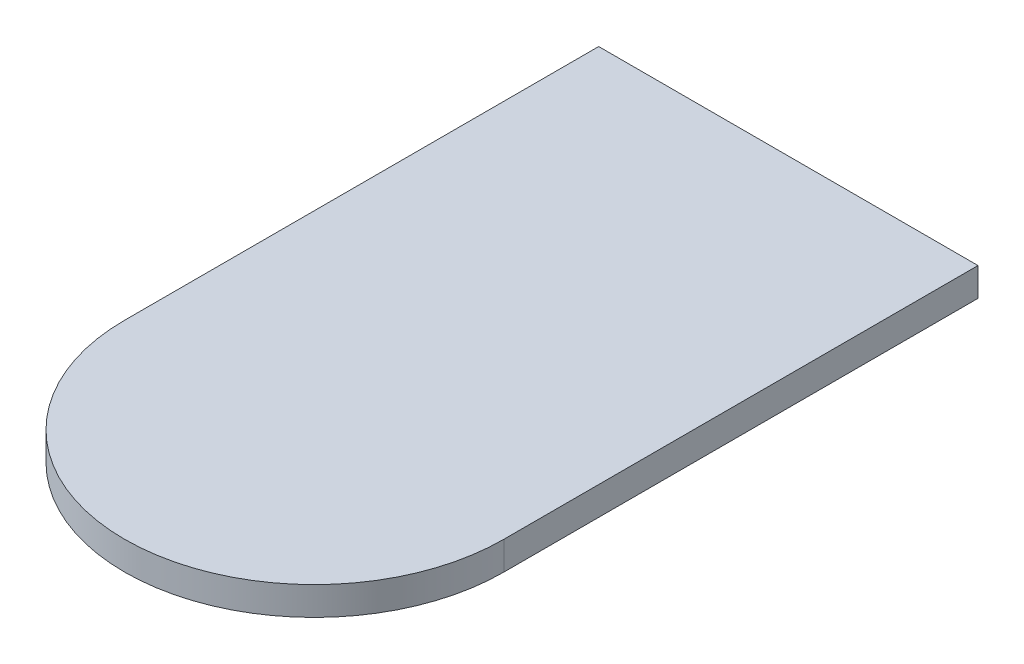
ISO-10303-21;
HEADER;
FILE_DESCRIPTION(('STEP AP214'),'2;1');
FILE_NAME('part.step','',(''),(''),'','','');
FILE_SCHEMA(('AUTOMOTIVE_DESIGN { 1 0 10303 214 1 1 1 1 }'));
ENDSEC;
DATA;
#1=APPLICATION_CONTEXT('core data for automotive mechanical design processes');
#2=APPLICATION_PROTOCOL_DEFINITION('international standard','automotive_design',2000,#1);
#3=PRODUCT_CONTEXT('',#1,'mechanical');
#4=PRODUCT('Part','Part','',(#3));
#5=PRODUCT_RELATED_PRODUCT_CATEGORY('part','',(#4));
#6=PRODUCT_DEFINITION_FORMATION('','',#4);
#7=PRODUCT_DEFINITION_CONTEXT('part definition',#1,'design');
#8=PRODUCT_DEFINITION('design','',#6,#7);
#9=PRODUCT_DEFINITION_SHAPE('','',#8);
#10=(LENGTH_UNIT() NAMED_UNIT(*) SI_UNIT(.MILLI.,.METRE.));
#11=(NAMED_UNIT(*) PLANE_ANGLE_UNIT() SI_UNIT($,.RADIAN.));
#12=(NAMED_UNIT(*) SI_UNIT($,.STERADIAN.) SOLID_ANGLE_UNIT());
#13=UNCERTAINTY_MEASURE_WITH_UNIT(LENGTH_MEASURE(1.E-05),#10,'distance_accuracy_value','');
#14=(GEOMETRIC_REPRESENTATION_CONTEXT(3) GLOBAL_UNCERTAINTY_ASSIGNED_CONTEXT((#13)) GLOBAL_UNIT_ASSIGNED_CONTEXT((#10,
#11,#12)) REPRESENTATION_CONTEXT('',''));
#15=CARTESIAN_POINT('',(0.,0.,0.));
#16=DIRECTION('',(0.,0.,1.));
#17=DIRECTION('',(1.,0.,0.));
#18=AXIS2_PLACEMENT_3D('',#15,#16,#17);
#19=CARTESIAN_POINT('',(0.,1.2,0.));
#20=DIRECTION('',(0.,-1.,0.));
#21=DIRECTION('',(0.,0.,-1.));
#22=AXIS2_PLACEMENT_3D('',#19,#20,#21);
#23=CYLINDRICAL_SURFACE('',#22,8.);
#24=CARTESIAN_POINT('',(0.,0.,0.));
#25=DIRECTION('',(0.,1.,0.));
#26=DIRECTION('',(0.,0.,1.));
#27=AXIS2_PLACEMENT_3D('',#24,#25,#26);
#28=CIRCLE('',#27,8.);
#29=CARTESIAN_POINT('',(-8.,0.,0.));
#30=VERTEX_POINT('',#29);
#31=CARTESIAN_POINT('',(8.,0.,0.));
#32=VERTEX_POINT('',#31);
#33=EDGE_CURVE('E96',#30,#32,#28,.T.);
#34=ORIENTED_EDGE('',*,*,#33,.T.);
#35=DIRECTION('',(0.,-1.,0.));
#36=VECTOR('',#35,1.);
#37=CARTESIAN_POINT('',(8.,1.2,0.));
#38=LINE('',#37,#36);
#39=CARTESIAN_POINT('',(8.,1.2,0.));
#40=VERTEX_POINT('',#39);
#41=EDGE_CURVE('E11',#40,#32,#38,.T.);
#42=ORIENTED_EDGE('',*,*,#41,.F.);
#43=CARTESIAN_POINT('',(0.,1.2,0.));
#44=DIRECTION('',(0.,1.,0.));
#45=DIRECTION('',(0.,0.,1.));
#46=AXIS2_PLACEMENT_3D('',#43,#44,#45);
#47=CIRCLE('',#46,8.);
#48=CARTESIAN_POINT('',(-8.,1.2,0.));
#49=VERTEX_POINT('',#48);
#50=EDGE_CURVE('E84',#49,#40,#47,.T.);
#51=ORIENTED_EDGE('',*,*,#50,.F.);
#52=DIRECTION('',(0.,-1.,0.));
#53=VECTOR('',#52,1.);
#54=CARTESIAN_POINT('',(-8.,1.2,0.));
#55=LINE('',#54,#53);
#56=EDGE_CURVE('E92',#49,#30,#55,.T.);
#57=ORIENTED_EDGE('',*,*,#56,.T.);
#58=EDGE_LOOP('',(#34,#42,#51,#57));
#59=FACE_BOUND('',#58,.T.);
#60=ADVANCED_FACE('F33',(#59),#23,.T.);
#61=CARTESIAN_POINT('',(8.,1.2,0.));
#62=DIRECTION('',(-1.,0.,0.));
#63=DIRECTION('',(0.,0.,1.));
#64=AXIS2_PLACEMENT_3D('',#61,#62,#63);
#65=PLANE('',#64);
#66=DIRECTION('',(0.,0.,-1.));
#67=VECTOR('',#66,1.);
#68=CARTESIAN_POINT('',(8.,0.,0.));
#69=LINE('',#68,#67);
#70=CARTESIAN_POINT('',(8.,0.,-20.));
#71=VERTEX_POINT('',#70);
#72=EDGE_CURVE('E88',#32,#71,#69,.T.);
#73=ORIENTED_EDGE('',*,*,#72,.T.);
#74=DIRECTION('',(0.,-1.,0.));
#75=VECTOR('',#74,1.);
#76=CARTESIAN_POINT('',(8.,1.2,-20.));
#77=LINE('',#76,#75);
#78=CARTESIAN_POINT('',(8.,1.2,-20.));
#79=VERTEX_POINT('',#78);
#80=EDGE_CURVE('E41',#79,#71,#77,.T.);
#81=ORIENTED_EDGE('',*,*,#80,.F.);
#82=DIRECTION('',(0.,0.,-1.));
#83=VECTOR('',#82,1.);
#84=CARTESIAN_POINT('',(8.,1.2,0.));
#85=LINE('',#84,#83);
#86=EDGE_CURVE('E79',#40,#79,#85,.T.);
#87=ORIENTED_EDGE('',*,*,#86,.F.);
#88=ORIENTED_EDGE('',*,*,#41,.T.);
#89=EDGE_LOOP('',(#73,#81,#87,#88));
#90=FACE_BOUND('',#89,.T.);
#91=ADVANCED_FACE('F87',(#90),#65,.F.);
#92=CARTESIAN_POINT('',(-8.,1.2,-20.));
#93=DIRECTION('',(0.,0.,1.));
#94=DIRECTION('',(1.,0.,0.));
#95=AXIS2_PLACEMENT_3D('',#92,#93,#94);
#96=PLANE('',#95);
#97=DIRECTION('',(-1.,0.,0.));
#98=VECTOR('',#97,1.);
#99=CARTESIAN_POINT('',(-8.,0.,-20.));
#100=LINE('',#99,#98);
#101=CARTESIAN_POINT('',(-8.,0.,-20.));
#102=VERTEX_POINT('',#101);
#103=EDGE_CURVE('E66',#71,#102,#100,.T.);
#104=ORIENTED_EDGE('',*,*,#103,.T.);
#105=DIRECTION('',(0.,-1.,0.));
#106=VECTOR('',#105,1.);
#107=CARTESIAN_POINT('',(-8.,1.2,-20.));
#108=LINE('',#107,#106);
#109=CARTESIAN_POINT('',(-8.,1.2,-20.));
#110=VERTEX_POINT('',#109);
#111=EDGE_CURVE('E89',#110,#102,#108,.T.);
#112=ORIENTED_EDGE('',*,*,#111,.F.);
#113=DIRECTION('',(-1.,0.,0.));
#114=VECTOR('',#113,1.);
#115=CARTESIAN_POINT('',(-8.,1.2,-20.));
#116=LINE('',#115,#114);
#117=EDGE_CURVE('E82',#79,#110,#116,.T.);
#118=ORIENTED_EDGE('',*,*,#117,.F.);
#119=ORIENTED_EDGE('',*,*,#80,.T.);
#120=EDGE_LOOP('',(#104,#112,#118,#119));
#121=FACE_BOUND('',#120,.T.);
#122=ADVANCED_FACE('F90',(#121),#96,.F.);
#123=CARTESIAN_POINT('',(-8.,1.2,0.));
#124=DIRECTION('',(1.,0.,0.));
#125=DIRECTION('',(0.,0.,-1.));
#126=AXIS2_PLACEMENT_3D('',#123,#124,#125);
#127=PLANE('',#126);
#128=DIRECTION('',(0.,0.,1.));
#129=VECTOR('',#128,1.);
#130=CARTESIAN_POINT('',(-8.,0.,0.));
#131=LINE('',#130,#129);
#132=EDGE_CURVE('E72',#102,#30,#131,.T.);
#133=ORIENTED_EDGE('',*,*,#132,.T.);
#134=ORIENTED_EDGE('',*,*,#56,.F.);
#135=DIRECTION('',(0.,0.,1.));
#136=VECTOR('',#135,1.);
#137=CARTESIAN_POINT('',(-8.,1.2,0.));
#138=LINE('',#137,#136);
#139=EDGE_CURVE('E49',#110,#49,#138,.T.);
#140=ORIENTED_EDGE('',*,*,#139,.F.);
#141=ORIENTED_EDGE('',*,*,#111,.T.);
#142=EDGE_LOOP('',(#133,#134,#140,#141));
#143=FACE_BOUND('',#142,.T.);
#144=ADVANCED_FACE('F103',(#143),#127,.F.);
#145=CARTESIAN_POINT('',(0.,1.2,0.));
#146=DIRECTION('',(0.,1.,0.));
#147=DIRECTION('',(0.,0.,1.));
#148=AXIS2_PLACEMENT_3D('',#145,#146,#147);
#149=PLANE('',#148);
#150=ORIENTED_EDGE('',*,*,#50,.T.);
#151=ORIENTED_EDGE('',*,*,#86,.T.);
#152=ORIENTED_EDGE('',*,*,#117,.T.);
#153=ORIENTED_EDGE('',*,*,#139,.T.);
#154=EDGE_LOOP('',(#150,#151,#152,#153));
#155=FACE_BOUND('',#154,.T.);
#156=ADVANCED_FACE('F80',(#155),#149,.T.);
#157=CARTESIAN_POINT('',(0.,0.,0.));
#158=DIRECTION('',(0.,1.,0.));
#159=DIRECTION('',(0.,0.,1.));
#160=AXIS2_PLACEMENT_3D('',#157,#158,#159);
#161=PLANE('',#160);
#162=ORIENTED_EDGE('',*,*,#33,.F.);
#163=ORIENTED_EDGE('',*,*,#132,.F.);
#164=ORIENTED_EDGE('',*,*,#103,.F.);
#165=ORIENTED_EDGE('',*,*,#72,.F.);
#166=EDGE_LOOP('',(#162,#163,#164,#165));
#167=FACE_BOUND('',#166,.T.);
#168=ADVANCED_FACE('F106',(#167),#161,.F.);
#169=CLOSED_SHELL('',(#60,#91,#122,#144,#156,#168));
#170=MANIFOLD_SOLID_BREP('B2',#169);
#171=ADVANCED_BREP_SHAPE_REPRESENTATION('',(#18,#170),#14);
#172=SHAPE_DEFINITION_REPRESENTATION(#9,#171);
ENDSEC;
END-ISO-10303-21;
